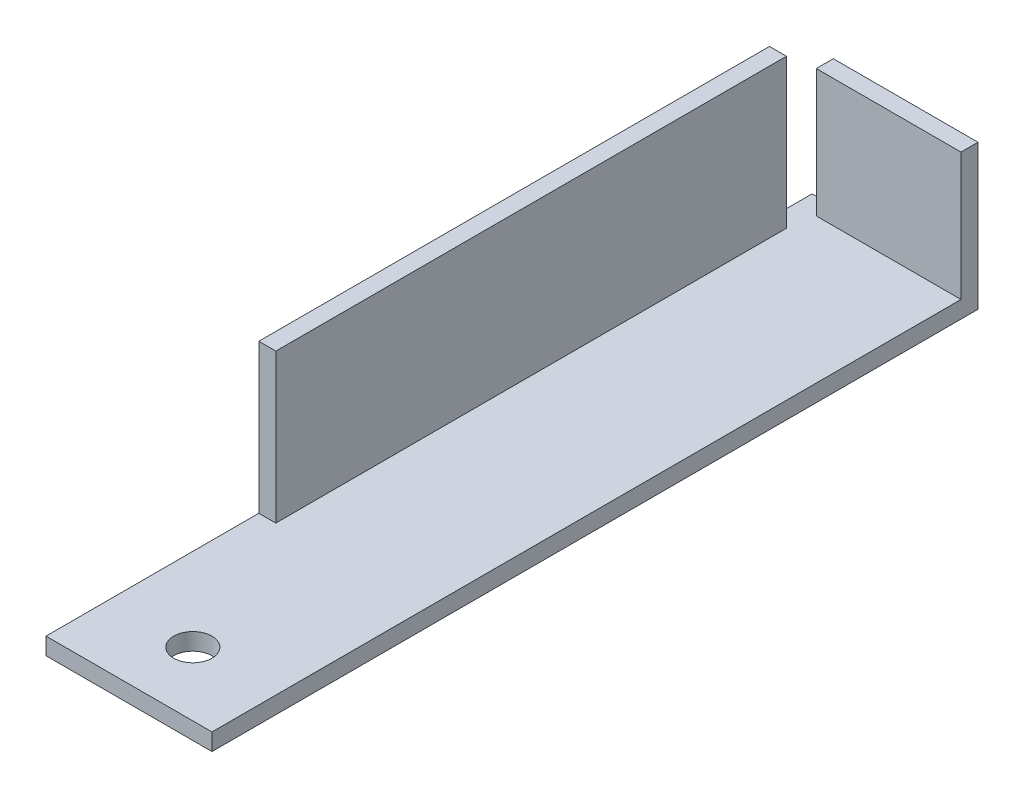
ISO-10303-21;
HEADER;
FILE_DESCRIPTION(('STEP AP214'),'2;1');
FILE_NAME('part.step','',(''),(''),'','','');
FILE_SCHEMA(('AUTOMOTIVE_DESIGN { 1 0 10303 214 1 1 1 1 }'));
ENDSEC;
DATA;
#1=APPLICATION_CONTEXT('core data for automotive mechanical design processes');
#2=APPLICATION_PROTOCOL_DEFINITION('international standard','automotive_design',2000,#1);
#3=PRODUCT_CONTEXT('',#1,'mechanical');
#4=PRODUCT('Part','Part','',(#3));
#5=PRODUCT_RELATED_PRODUCT_CATEGORY('part','',(#4));
#6=PRODUCT_DEFINITION_FORMATION('','',#4);
#7=PRODUCT_DEFINITION_CONTEXT('part definition',#1,'design');
#8=PRODUCT_DEFINITION('design','',#6,#7);
#9=PRODUCT_DEFINITION_SHAPE('','',#8);
#10=(LENGTH_UNIT() NAMED_UNIT(*) SI_UNIT(.MILLI.,.METRE.));
#11=(NAMED_UNIT(*) PLANE_ANGLE_UNIT() SI_UNIT($,.RADIAN.));
#12=(NAMED_UNIT(*) SI_UNIT($,.STERADIAN.) SOLID_ANGLE_UNIT());
#13=UNCERTAINTY_MEASURE_WITH_UNIT(LENGTH_MEASURE(1.E-05),#10,'distance_accuracy_value','');
#14=(GEOMETRIC_REPRESENTATION_CONTEXT(3) GLOBAL_UNCERTAINTY_ASSIGNED_CONTEXT((#13)) GLOBAL_UNIT_ASSIGNED_CONTEXT((#10,
#11,#12)) REPRESENTATION_CONTEXT('',''));
#15=CARTESIAN_POINT('',(0.,0.,0.));
#16=DIRECTION('',(0.,0.,1.));
#17=DIRECTION('',(1.,0.,0.));
#18=AXIS2_PLACEMENT_3D('',#15,#16,#17);
#19=CARTESIAN_POINT('',(2.,2.,90.));
#20=DIRECTION('',(0.,-1.,0.));
#21=DIRECTION('',(0.,0.,-1.));
#22=AXIS2_PLACEMENT_3D('',#19,#20,#21);
#23=PLANE('',#22);
#24=CARTESIAN_POINT('',(9.75,2.,82.5));
#25=DIRECTION('',(0.,1.,0.));
#26=DIRECTION('',(0.,0.,1.));
#27=AXIS2_PLACEMENT_3D('',#24,#25,#26);
#28=CIRCLE('',#27,2.25);
#29=CARTESIAN_POINT('',(9.75,2.,84.75));
#30=VERTEX_POINT('',#29);
#31=EDGE_CURVE('E146',#30,#30,#28,.T.);
#32=ORIENTED_EDGE('',*,*,#31,.F.);
#33=EDGE_LOOP('',(#32));
#34=FACE_BOUND('',#33,.T.);
#35=DIRECTION('',(0.,0.,1.));
#36=VECTOR('',#35,1.);
#37=CARTESIAN_POINT('',(2.5,2.,0.));
#38=LINE('',#37,#36);
#39=CARTESIAN_POINT('',(2.5,2.,0.));
#40=VERTEX_POINT('',#39);
#41=CARTESIAN_POINT('',(2.5,2.,2.));
#42=VERTEX_POINT('',#41);
#43=EDGE_CURVE('E143',#40,#42,#38,.T.);
#44=ORIENTED_EDGE('',*,*,#43,.F.);
#45=DIRECTION('',(-1.,0.,0.));
#46=VECTOR('',#45,1.);
#47=CARTESIAN_POINT('',(2.,2.,0.));
#48=LINE('',#47,#46);
#49=CARTESIAN_POINT('',(0.,2.,0.));
#50=VERTEX_POINT('',#49);
#51=EDGE_CURVE('E125',#40,#50,#48,.T.);
#52=ORIENTED_EDGE('',*,*,#51,.T.);
#53=DIRECTION('',(0.,0.,-1.));
#54=VECTOR('',#53,1.);
#55=CARTESIAN_POINT('',(0.,2.,0.));
#56=LINE('',#55,#54);
#57=CARTESIAN_POINT('',(0.,2.,5.));
#58=VERTEX_POINT('',#57);
#59=EDGE_CURVE('E177',#58,#50,#56,.T.);
#60=ORIENTED_EDGE('',*,*,#59,.F.);
#61=DIRECTION('',(1.,0.,0.));
#62=VECTOR('',#61,1.);
#63=CARTESIAN_POINT('',(0.,2.,5.));
#64=LINE('',#63,#62);
#65=CARTESIAN_POINT('',(2.,2.,5.));
#66=VERTEX_POINT('',#65);
#67=EDGE_CURVE('E169',#58,#66,#64,.T.);
#68=ORIENTED_EDGE('',*,*,#67,.T.);
#69=DIRECTION('',(0.,0.,-1.));
#70=VECTOR('',#69,1.);
#71=CARTESIAN_POINT('',(2.,2.,90.));
#72=LINE('',#71,#70);
#73=CARTESIAN_POINT('',(2.,2.,65.));
#74=VERTEX_POINT('',#73);
#75=EDGE_CURVE('E207',#74,#66,#72,.T.);
#76=ORIENTED_EDGE('',*,*,#75,.F.);
#77=DIRECTION('',(1.,0.,0.));
#78=VECTOR('',#77,1.);
#79=CARTESIAN_POINT('',(0.,2.,65.));
#80=LINE('',#79,#78);
#81=CARTESIAN_POINT('',(0.,2.,65.));
#82=VERTEX_POINT('',#81);
#83=EDGE_CURVE('E167',#82,#74,#80,.T.);
#84=ORIENTED_EDGE('',*,*,#83,.F.);
#85=DIRECTION('',(0.,0.,-1.));
#86=VECTOR('',#85,1.);
#87=CARTESIAN_POINT('',(0.,2.,90.));
#88=LINE('',#87,#86);
#89=CARTESIAN_POINT('',(0.,2.,90.));
#90=VERTEX_POINT('',#89);
#91=EDGE_CURVE('E160',#90,#82,#88,.T.);
#92=ORIENTED_EDGE('',*,*,#91,.F.);
#93=DIRECTION('',(-1.,0.,0.));
#94=VECTOR('',#93,1.);
#95=CARTESIAN_POINT('',(2.,2.,90.));
#96=LINE('',#95,#94);
#97=CARTESIAN_POINT('',(19.5,2.,90.));
#98=VERTEX_POINT('',#97);
#99=EDGE_CURVE('E191',#98,#90,#96,.T.);
#100=ORIENTED_EDGE('',*,*,#99,.F.);
#101=DIRECTION('',(0.,0.,-1.));
#102=VECTOR('',#101,1.);
#103=CARTESIAN_POINT('',(19.5,2.,90.));
#104=LINE('',#103,#102);
#105=CARTESIAN_POINT('',(19.5,2.,2.00000000000003));
#106=VERTEX_POINT('',#105);
#107=EDGE_CURVE('E42',#98,#106,#104,.T.);
#108=ORIENTED_EDGE('',*,*,#107,.T.);
#109=DIRECTION('',(1.,0.,0.));
#110=VECTOR('',#109,1.);
#111=CARTESIAN_POINT('',(19.5,2.,2.));
#112=LINE('',#111,#110);
#113=EDGE_CURVE('E49',#42,#106,#112,.T.);
#114=ORIENTED_EDGE('',*,*,#113,.F.);
#115=EDGE_LOOP('',(#44,#52,#60,#68,#76,#84,#92,#100,#108,#114));
#116=FACE_BOUND('',#115,.T.);
#117=ADVANCED_FACE('F34',(#34,#116),#23,.F.);
#118=CARTESIAN_POINT('',(19.5,0.,90.));
#119=DIRECTION('',(0.,1.,0.));
#120=DIRECTION('',(-1.,0.,0.));
#121=AXIS2_PLACEMENT_3D('',#118,#119,#120);
#122=PLANE('',#121);
#123=CARTESIAN_POINT('',(9.75,0.,82.5));
#124=DIRECTION('',(0.,1.,0.));
#125=DIRECTION('',(0.,0.,1.));
#126=AXIS2_PLACEMENT_3D('',#123,#124,#125);
#127=CIRCLE('',#126,2.25);
#128=CARTESIAN_POINT('',(9.75,0.,84.75));
#129=VERTEX_POINT('',#128);
#130=EDGE_CURVE('E152',#129,#129,#127,.T.);
#131=ORIENTED_EDGE('',*,*,#130,.T.);
#132=EDGE_LOOP('',(#131));
#133=FACE_BOUND('',#132,.T.);
#134=DIRECTION('',(1.,0.,0.));
#135=VECTOR('',#134,1.);
#136=CARTESIAN_POINT('',(19.5,0.,0.));
#137=LINE('',#136,#135);
#138=CARTESIAN_POINT('',(0.,0.,0.));
#139=VERTEX_POINT('',#138);
#140=CARTESIAN_POINT('',(19.5,0.,0.));
#141=VERTEX_POINT('',#140);
#142=EDGE_CURVE('E126',#139,#141,#137,.T.);
#143=ORIENTED_EDGE('',*,*,#142,.T.);
#144=DIRECTION('',(0.,0.,-1.));
#145=VECTOR('',#144,1.);
#146=CARTESIAN_POINT('',(19.5,0.,90.));
#147=LINE('',#146,#145);
#148=CARTESIAN_POINT('',(19.5,0.,90.));
#149=VERTEX_POINT('',#148);
#150=EDGE_CURVE('E11',#149,#141,#147,.T.);
#151=ORIENTED_EDGE('',*,*,#150,.F.);
#152=DIRECTION('',(1.,0.,0.));
#153=VECTOR('',#152,1.);
#154=CARTESIAN_POINT('',(19.5,0.,90.));
#155=LINE('',#154,#153);
#156=CARTESIAN_POINT('',(0.,0.,90.));
#157=VERTEX_POINT('',#156);
#158=EDGE_CURVE('E185',#157,#149,#155,.T.);
#159=ORIENTED_EDGE('',*,*,#158,.F.);
#160=DIRECTION('',(0.,0.,-1.));
#161=VECTOR('',#160,1.);
#162=CARTESIAN_POINT('',(0.,0.,90.));
#163=LINE('',#162,#161);
#164=EDGE_CURVE('E195',#157,#139,#163,.T.);
#165=ORIENTED_EDGE('',*,*,#164,.T.);
#166=EDGE_LOOP('',(#143,#151,#159,#165));
#167=FACE_BOUND('',#166,.T.);
#168=ADVANCED_FACE('F36',(#133,#167),#122,.F.);
#169=CARTESIAN_POINT('',(19.5,2.,90.));
#170=DIRECTION('',(-1.,0.,0.));
#171=DIRECTION('',(0.,0.,1.));
#172=AXIS2_PLACEMENT_3D('',#169,#170,#171);
#173=PLANE('',#172);
#174=DIRECTION('',(0.,1.,0.));
#175=VECTOR('',#174,1.);
#176=CARTESIAN_POINT('',(19.5,2.,0.));
#177=LINE('',#176,#175);
#178=CARTESIAN_POINT('',(19.5,17.,0.));
#179=VERTEX_POINT('',#178);
#180=EDGE_CURVE('E115',#141,#179,#177,.T.);
#181=ORIENTED_EDGE('',*,*,#180,.T.);
#182=DIRECTION('',(0.,0.,-1.));
#183=VECTOR('',#182,1.);
#184=CARTESIAN_POINT('',(19.5,17.,0.));
#185=LINE('',#184,#183);
#186=CARTESIAN_POINT('',(19.5,17.,2.));
#187=VERTEX_POINT('',#186);
#188=EDGE_CURVE('E120',#187,#179,#185,.T.);
#189=ORIENTED_EDGE('',*,*,#188,.F.);
#190=DIRECTION('',(0.,-1.,0.));
#191=VECTOR('',#190,1.);
#192=CARTESIAN_POINT('',(19.5,17.,2.));
#193=LINE('',#192,#191);
#194=EDGE_CURVE('E151',#187,#106,#193,.T.);
#195=ORIENTED_EDGE('',*,*,#194,.T.);
#196=ORIENTED_EDGE('',*,*,#107,.F.);
#197=DIRECTION('',(0.,1.,0.));
#198=VECTOR('',#197,1.);
#199=CARTESIAN_POINT('',(19.5,2.,90.));
#200=LINE('',#199,#198);
#201=EDGE_CURVE('E188',#149,#98,#200,.T.);
#202=ORIENTED_EDGE('',*,*,#201,.F.);
#203=ORIENTED_EDGE('',*,*,#150,.T.);
#204=EDGE_LOOP('',(#181,#189,#195,#196,#202,#203));
#205=FACE_BOUND('',#204,.T.);
#206=ADVANCED_FACE('F117',(#205),#173,.F.);
#207=CARTESIAN_POINT('',(2.,19.5,90.));
#208=DIRECTION('',(-1.,0.,0.));
#209=DIRECTION('',(0.,-1.,0.));
#210=AXIS2_PLACEMENT_3D('',#207,#208,#209);
#211=PLANE('',#210);
#212=DIRECTION('',(0.,0.,-1.));
#213=VECTOR('',#212,1.);
#214=CARTESIAN_POINT('',(2.,19.5,90.));
#215=LINE('',#214,#213);
#216=CARTESIAN_POINT('',(2.,19.5,65.));
#217=VERTEX_POINT('',#216);
#218=CARTESIAN_POINT('',(2.,19.5,5.));
#219=VERTEX_POINT('',#218);
#220=EDGE_CURVE('E204',#217,#219,#215,.T.);
#221=ORIENTED_EDGE('',*,*,#220,.F.);
#222=DIRECTION('',(0.,1.,0.));
#223=VECTOR('',#222,1.);
#224=CARTESIAN_POINT('',(2.,19.5,65.));
#225=LINE('',#224,#223);
#226=EDGE_CURVE('E164',#74,#217,#225,.T.);
#227=ORIENTED_EDGE('',*,*,#226,.F.);
#228=ORIENTED_EDGE('',*,*,#75,.T.);
#229=DIRECTION('',(0.,-1.,0.));
#230=VECTOR('',#229,1.);
#231=CARTESIAN_POINT('',(2.,19.5,5.));
#232=LINE('',#231,#230);
#233=EDGE_CURVE('E159',#219,#66,#232,.T.);
#234=ORIENTED_EDGE('',*,*,#233,.F.);
#235=EDGE_LOOP('',(#221,#227,#228,#234));
#236=FACE_BOUND('',#235,.T.);
#237=ADVANCED_FACE('F214',(#236),#211,.F.);
#238=CARTESIAN_POINT('',(0.,19.5,90.));
#239=DIRECTION('',(0.,-1.,0.));
#240=DIRECTION('',(0.,0.,-1.));
#241=AXIS2_PLACEMENT_3D('',#238,#239,#240);
#242=PLANE('',#241);
#243=DIRECTION('',(0.,0.,-1.));
#244=VECTOR('',#243,1.);
#245=CARTESIAN_POINT('',(0.,19.5,90.));
#246=LINE('',#245,#244);
#247=CARTESIAN_POINT('',(0.,19.5,65.));
#248=VERTEX_POINT('',#247);
#249=CARTESIAN_POINT('',(0.,19.5,5.));
#250=VERTEX_POINT('',#249);
#251=EDGE_CURVE('E201',#248,#250,#246,.T.);
#252=ORIENTED_EDGE('',*,*,#251,.F.);
#253=DIRECTION('',(1.,0.,0.));
#254=VECTOR('',#253,1.);
#255=CARTESIAN_POINT('',(0.,19.5,65.));
#256=LINE('',#255,#254);
#257=EDGE_CURVE('E170',#248,#217,#256,.T.);
#258=ORIENTED_EDGE('',*,*,#257,.T.);
#259=ORIENTED_EDGE('',*,*,#220,.T.);
#260=DIRECTION('',(1.,0.,0.));
#261=VECTOR('',#260,1.);
#262=CARTESIAN_POINT('',(0.,19.5,5.));
#263=LINE('',#262,#261);
#264=EDGE_CURVE('E180',#250,#219,#263,.T.);
#265=ORIENTED_EDGE('',*,*,#264,.F.);
#266=EDGE_LOOP('',(#252,#258,#259,#265));
#267=FACE_BOUND('',#266,.T.);
#268=ADVANCED_FACE('F223',(#267),#242,.F.);
#269=CARTESIAN_POINT('',(0.,0.,90.));
#270=DIRECTION('',(1.,0.,0.));
#271=DIRECTION('',(0.,0.,-1.));
#272=AXIS2_PLACEMENT_3D('',#269,#270,#271);
#273=PLANE('',#272);
#274=ORIENTED_EDGE('',*,*,#91,.T.);
#275=DIRECTION('',(0.,1.,0.));
#276=VECTOR('',#275,1.);
#277=CARTESIAN_POINT('',(0.,19.5,65.));
#278=LINE('',#277,#276);
#279=EDGE_CURVE('E163',#82,#248,#278,.T.);
#280=ORIENTED_EDGE('',*,*,#279,.T.);
#281=ORIENTED_EDGE('',*,*,#251,.T.);
#282=DIRECTION('',(0.,-1.,0.));
#283=VECTOR('',#282,1.);
#284=CARTESIAN_POINT('',(0.,19.5,5.));
#285=LINE('',#284,#283);
#286=EDGE_CURVE('E174',#250,#58,#285,.T.);
#287=ORIENTED_EDGE('',*,*,#286,.T.);
#288=ORIENTED_EDGE('',*,*,#59,.T.);
#289=DIRECTION('',(0.,-1.,0.));
#290=VECTOR('',#289,1.);
#291=CARTESIAN_POINT('',(0.,0.,0.));
#292=LINE('',#291,#290);
#293=EDGE_CURVE('E189',#50,#139,#292,.T.);
#294=ORIENTED_EDGE('',*,*,#293,.T.);
#295=ORIENTED_EDGE('',*,*,#164,.F.);
#296=DIRECTION('',(0.,-1.,0.));
#297=VECTOR('',#296,1.);
#298=CARTESIAN_POINT('',(0.,0.,90.));
#299=LINE('',#298,#297);
#300=EDGE_CURVE('E193',#90,#157,#299,.T.);
#301=ORIENTED_EDGE('',*,*,#300,.F.);
#302=EDGE_LOOP('',(#274,#280,#281,#287,#288,#294,#295,#301));
#303=FACE_BOUND('',#302,.T.);
#304=ADVANCED_FACE('F225',(#303),#273,.F.);
#305=CARTESIAN_POINT('',(0.,0.,90.));
#306=DIRECTION('',(0.,0.,-1.));
#307=DIRECTION('',(-1.,0.,0.));
#308=AXIS2_PLACEMENT_3D('',#305,#306,#307);
#309=PLANE('',#308);
#310=ORIENTED_EDGE('',*,*,#99,.T.);
#311=ORIENTED_EDGE('',*,*,#300,.T.);
#312=ORIENTED_EDGE('',*,*,#158,.T.);
#313=ORIENTED_EDGE('',*,*,#201,.T.);
#314=EDGE_LOOP('',(#310,#311,#312,#313));
#315=FACE_BOUND('',#314,.T.);
#316=ADVANCED_FACE('F260',(#315),#309,.F.);
#317=CARTESIAN_POINT('',(0.,0.,0.));
#318=DIRECTION('',(0.,0.,-1.));
#319=DIRECTION('',(-1.,0.,0.));
#320=AXIS2_PLACEMENT_3D('',#317,#318,#319);
#321=PLANE('',#320);
#322=ORIENTED_EDGE('',*,*,#293,.F.);
#323=ORIENTED_EDGE('',*,*,#51,.F.);
#324=DIRECTION('',(0.,-1.,0.));
#325=VECTOR('',#324,1.);
#326=CARTESIAN_POINT('',(2.5,17.,0.));
#327=LINE('',#326,#325);
#328=CARTESIAN_POINT('',(2.5,17.,0.));
#329=VERTEX_POINT('',#328);
#330=EDGE_CURVE('E133',#329,#40,#327,.T.);
#331=ORIENTED_EDGE('',*,*,#330,.F.);
#332=DIRECTION('',(-1.,0.,0.));
#333=VECTOR('',#332,1.);
#334=CARTESIAN_POINT('',(19.5,17.,0.));
#335=LINE('',#334,#333);
#336=EDGE_CURVE('E129',#179,#329,#335,.T.);
#337=ORIENTED_EDGE('',*,*,#336,.F.);
#338=ORIENTED_EDGE('',*,*,#180,.F.);
#339=ORIENTED_EDGE('',*,*,#142,.F.);
#340=EDGE_LOOP('',(#322,#323,#331,#337,#338,#339));
#341=FACE_BOUND('',#340,.T.);
#342=ADVANCED_FACE('F131',(#341),#321,.T.);
#343=CARTESIAN_POINT('',(0.,19.5,5.));
#344=DIRECTION('',(0.,0.,1.));
#345=DIRECTION('',(0.,-1.,0.));
#346=AXIS2_PLACEMENT_3D('',#343,#344,#345);
#347=PLANE('',#346);
#348=ORIENTED_EDGE('',*,*,#233,.T.);
#349=ORIENTED_EDGE('',*,*,#67,.F.);
#350=ORIENTED_EDGE('',*,*,#286,.F.);
#351=ORIENTED_EDGE('',*,*,#264,.T.);
#352=EDGE_LOOP('',(#348,#349,#350,#351));
#353=FACE_BOUND('',#352,.T.);
#354=ADVANCED_FACE('F219',(#353),#347,.F.);
#355=CARTESIAN_POINT('',(0.,19.5,65.));
#356=DIRECTION('',(0.,0.,-1.));
#357=DIRECTION('',(-1.,0.,0.));
#358=AXIS2_PLACEMENT_3D('',#355,#356,#357);
#359=PLANE('',#358);
#360=ORIENTED_EDGE('',*,*,#226,.T.);
#361=ORIENTED_EDGE('',*,*,#257,.F.);
#362=ORIENTED_EDGE('',*,*,#279,.F.);
#363=ORIENTED_EDGE('',*,*,#83,.T.);
#364=EDGE_LOOP('',(#360,#361,#362,#363));
#365=FACE_BOUND('',#364,.T.);
#366=ADVANCED_FACE('F228',(#365),#359,.F.);
#367=CARTESIAN_POINT('',(2.5,17.,0.));
#368=DIRECTION('',(1.,0.,0.));
#369=DIRECTION('',(0.,0.,-1.));
#370=AXIS2_PLACEMENT_3D('',#367,#368,#369);
#371=PLANE('',#370);
#372=ORIENTED_EDGE('',*,*,#43,.T.);
#373=DIRECTION('',(0.,-1.,0.));
#374=VECTOR('',#373,1.);
#375=CARTESIAN_POINT('',(2.5,17.,2.));
#376=LINE('',#375,#374);
#377=CARTESIAN_POINT('',(2.5,17.,2.));
#378=VERTEX_POINT('',#377);
#379=EDGE_CURVE('E155',#378,#42,#376,.T.);
#380=ORIENTED_EDGE('',*,*,#379,.F.);
#381=DIRECTION('',(0.,0.,1.));
#382=VECTOR('',#381,1.);
#383=CARTESIAN_POINT('',(2.5,17.,0.));
#384=LINE('',#383,#382);
#385=EDGE_CURVE('E136',#329,#378,#384,.T.);
#386=ORIENTED_EDGE('',*,*,#385,.F.);
#387=ORIENTED_EDGE('',*,*,#330,.T.);
#388=EDGE_LOOP('',(#372,#380,#386,#387));
#389=FACE_BOUND('',#388,.T.);
#390=ADVANCED_FACE('F230',(#389),#371,.F.);
#391=CARTESIAN_POINT('',(19.5,17.,2.));
#392=DIRECTION('',(0.,0.,-1.));
#393=DIRECTION('',(-1.,0.,0.));
#394=AXIS2_PLACEMENT_3D('',#391,#392,#393);
#395=PLANE('',#394);
#396=ORIENTED_EDGE('',*,*,#113,.T.);
#397=ORIENTED_EDGE('',*,*,#194,.F.);
#398=DIRECTION('',(1.,0.,0.));
#399=VECTOR('',#398,1.);
#400=CARTESIAN_POINT('',(19.5,17.,2.));
#401=LINE('',#400,#399);
#402=EDGE_CURVE('E140',#378,#187,#401,.T.);
#403=ORIENTED_EDGE('',*,*,#402,.F.);
#404=ORIENTED_EDGE('',*,*,#379,.T.);
#405=EDGE_LOOP('',(#396,#397,#403,#404));
#406=FACE_BOUND('',#405,.T.);
#407=ADVANCED_FACE('F236',(#406),#395,.F.);
#408=CARTESIAN_POINT('',(0.,17.,0.));
#409=DIRECTION('',(0.,-1.,0.));
#410=DIRECTION('',(0.,0.,-1.));
#411=AXIS2_PLACEMENT_3D('',#408,#409,#410);
#412=PLANE('',#411);
#413=ORIENTED_EDGE('',*,*,#188,.T.);
#414=ORIENTED_EDGE('',*,*,#336,.T.);
#415=ORIENTED_EDGE('',*,*,#385,.T.);
#416=ORIENTED_EDGE('',*,*,#402,.T.);
#417=EDGE_LOOP('',(#413,#414,#415,#416));
#418=FACE_BOUND('',#417,.T.);
#419=ADVANCED_FACE('F138',(#418),#412,.F.);
#420=CARTESIAN_POINT('',(9.75,0.,82.5));
#421=DIRECTION('',(0.,1.,0.));
#422=DIRECTION('',(0.,0.,1.));
#423=AXIS2_PLACEMENT_3D('',#420,#421,#422);
#424=CYLINDRICAL_SURFACE('',#423,2.25);
#425=ORIENTED_EDGE('',*,*,#130,.F.);
#426=EDGE_LOOP('',(#425));
#427=FACE_BOUND('',#426,.T.);
#428=ORIENTED_EDGE('',*,*,#31,.T.);
#429=EDGE_LOOP('',(#428));
#430=FACE_BOUND('',#429,.T.);
#431=ADVANCED_FACE('F279',(#427,#430),#424,.F.);
#432=CLOSED_SHELL('',(#117,#168,#206,#237,#268,#304,#316,#342,#354,#366,#390,#407,#419,#431));
#433=MANIFOLD_SOLID_BREP('B2',#432);
#434=ADVANCED_BREP_SHAPE_REPRESENTATION('',(#18,#433),#14);
#435=SHAPE_DEFINITION_REPRESENTATION(#9,#434);
ENDSEC;
END-ISO-10303-21;
